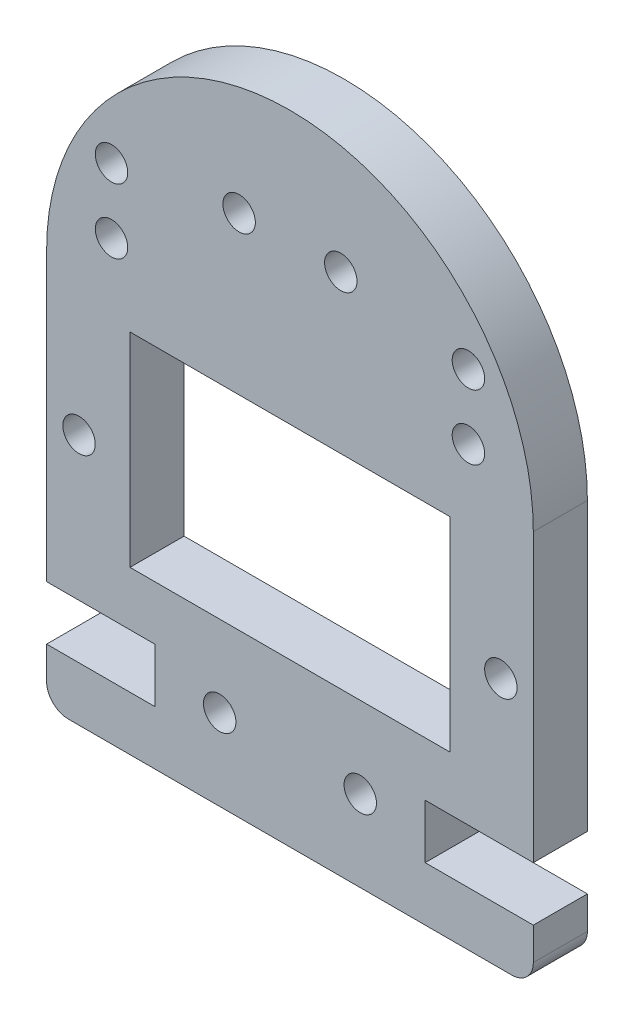
ISO-10303-21;
HEADER;
FILE_DESCRIPTION(('STEP AP214'),'2;1');
FILE_NAME('part.step','',(''),(''),'','','');
FILE_SCHEMA(('AUTOMOTIVE_DESIGN { 1 0 10303 214 1 1 1 1 }'));
ENDSEC;
DATA;
#1=APPLICATION_CONTEXT('core data for automotive mechanical design processes');
#2=APPLICATION_PROTOCOL_DEFINITION('international standard','automotive_design',2000,#1);
#3=PRODUCT_CONTEXT('',#1,'mechanical');
#4=PRODUCT('Part','Part','',(#3));
#5=PRODUCT_RELATED_PRODUCT_CATEGORY('part','',(#4));
#6=PRODUCT_DEFINITION_FORMATION('','',#4);
#7=PRODUCT_DEFINITION_CONTEXT('part definition',#1,'design');
#8=PRODUCT_DEFINITION('design','',#6,#7);
#9=PRODUCT_DEFINITION_SHAPE('','',#8);
#10=(LENGTH_UNIT() NAMED_UNIT(*) SI_UNIT(.MILLI.,.METRE.));
#11=(NAMED_UNIT(*) PLANE_ANGLE_UNIT() SI_UNIT($,.RADIAN.));
#12=(NAMED_UNIT(*) SI_UNIT($,.STERADIAN.) SOLID_ANGLE_UNIT());
#13=UNCERTAINTY_MEASURE_WITH_UNIT(LENGTH_MEASURE(1.E-05),#10,'distance_accuracy_value','');
#14=(GEOMETRIC_REPRESENTATION_CONTEXT(3) GLOBAL_UNCERTAINTY_ASSIGNED_CONTEXT((#13)) GLOBAL_UNIT_ASSIGNED_CONTEXT((#10,
#11,#12)) REPRESENTATION_CONTEXT('',''));
#15=CARTESIAN_POINT('',(0.,0.,0.));
#16=DIRECTION('',(0.,0.,1.));
#17=DIRECTION('',(1.,0.,0.));
#18=AXIS2_PLACEMENT_3D('',#15,#16,#17);
#19=CARTESIAN_POINT('',(-1.76634170575383,13.25,5.));
#20=DIRECTION('',(0.,0.,-1.));
#21=DIRECTION('',(-1.,0.,0.));
#22=AXIS2_PLACEMENT_3D('',#19,#20,#21);
#23=CYLINDRICAL_SURFACE('',#22,22.5);
#24=CARTESIAN_POINT('',(-1.76634170575383,13.25,0.));
#25=DIRECTION('',(0.,0.,1.));
#26=DIRECTION('',(1.,0.,0.));
#27=AXIS2_PLACEMENT_3D('',#24,#25,#26);
#28=CIRCLE('',#27,22.5);
#29=CARTESIAN_POINT('',(20.7336582942462,13.25,0.));
#30=VERTEX_POINT('',#29);
#31=CARTESIAN_POINT('',(-24.2663417057538,13.25,0.));
#32=VERTEX_POINT('',#31);
#33=EDGE_CURVE('E198',#30,#32,#28,.T.);
#34=ORIENTED_EDGE('',*,*,#33,.T.);
#35=DIRECTION('',(0.,0.,-1.));
#36=VECTOR('',#35,1.);
#37=CARTESIAN_POINT('',(-24.2663417057538,13.25,5.));
#38=LINE('',#37,#36);
#39=CARTESIAN_POINT('',(-24.2663417057538,13.25,5.));
#40=VERTEX_POINT('',#39);
#41=EDGE_CURVE('E11',#40,#32,#38,.T.);
#42=ORIENTED_EDGE('',*,*,#41,.F.);
#43=CARTESIAN_POINT('',(-1.76634170575383,13.25,5.));
#44=DIRECTION('',(0.,0.,1.));
#45=DIRECTION('',(1.,0.,0.));
#46=AXIS2_PLACEMENT_3D('',#43,#44,#45);
#47=CIRCLE('',#46,22.5);
#48=CARTESIAN_POINT('',(20.7336582942462,13.25,5.));
#49=VERTEX_POINT('',#48);
#50=EDGE_CURVE('E202',#49,#40,#47,.T.);
#51=ORIENTED_EDGE('',*,*,#50,.F.);
#52=DIRECTION('',(0.,0.,-1.));
#53=VECTOR('',#52,1.);
#54=CARTESIAN_POINT('',(20.7336582942462,13.25,5.));
#55=LINE('',#54,#53);
#56=EDGE_CURVE('E232',#49,#30,#55,.T.);
#57=ORIENTED_EDGE('',*,*,#56,.T.);
#58=EDGE_LOOP('',(#34,#42,#51,#57));
#59=FACE_BOUND('',#58,.T.);
#60=ADVANCED_FACE('F35',(#59),#23,.T.);
#61=CARTESIAN_POINT('',(-24.2663417057538,-13.25,5.));
#62=DIRECTION('',(1.,0.,0.));
#63=DIRECTION('',(0.,0.,-1.));
#64=AXIS2_PLACEMENT_3D('',#61,#62,#63);
#65=PLANE('',#64);
#66=DIRECTION('',(0.,-1.,0.));
#67=VECTOR('',#66,1.);
#68=CARTESIAN_POINT('',(-24.2663417057538,-13.25,0.));
#69=LINE('',#68,#67);
#70=CARTESIAN_POINT('',(-24.2663417057538,-13.25,0.));
#71=VERTEX_POINT('',#70);
#72=EDGE_CURVE('E235',#32,#71,#69,.T.);
#73=ORIENTED_EDGE('',*,*,#72,.T.);
#74=DIRECTION('',(0.,0.,-1.));
#75=VECTOR('',#74,1.);
#76=CARTESIAN_POINT('',(-24.2663417057538,-13.25,5.));
#77=LINE('',#76,#75);
#78=CARTESIAN_POINT('',(-24.2663417057538,-13.25,5.));
#79=VERTEX_POINT('',#78);
#80=EDGE_CURVE('E43',#79,#71,#77,.T.);
#81=ORIENTED_EDGE('',*,*,#80,.F.);
#82=DIRECTION('',(0.,-1.,0.));
#83=VECTOR('',#82,1.);
#84=CARTESIAN_POINT('',(-24.2663417057538,-3.25,5.));
#85=LINE('',#84,#83);
#86=EDGE_CURVE('E205',#40,#79,#85,.T.);
#87=ORIENTED_EDGE('',*,*,#86,.F.);
#88=ORIENTED_EDGE('',*,*,#41,.T.);
#89=EDGE_LOOP('',(#73,#81,#87,#88));
#90=FACE_BOUND('',#89,.T.);
#91=ADVANCED_FACE('F428',(#90),#65,.F.);
#92=CARTESIAN_POINT('',(-14.2663417057538,-13.25,5.));
#93=DIRECTION('',(0.,1.,0.));
#94=DIRECTION('',(0.,0.,1.));
#95=AXIS2_PLACEMENT_3D('',#92,#93,#94);
#96=PLANE('',#95);
#97=DIRECTION('',(1.,0.,0.));
#98=VECTOR('',#97,1.);
#99=CARTESIAN_POINT('',(-14.2663417057538,-13.25,0.));
#100=LINE('',#99,#98);
#101=CARTESIAN_POINT('',(-14.2663417057538,-13.25,0.));
#102=VERTEX_POINT('',#101);
#103=EDGE_CURVE('E237',#71,#102,#100,.T.);
#104=ORIENTED_EDGE('',*,*,#103,.T.);
#105=DIRECTION('',(0.,0.,-1.));
#106=VECTOR('',#105,1.);
#107=CARTESIAN_POINT('',(-14.2663417057538,-13.25,5.));
#108=LINE('',#107,#106);
#109=CARTESIAN_POINT('',(-14.2663417057538,-13.25,5.));
#110=VERTEX_POINT('',#109);
#111=EDGE_CURVE('E293',#110,#102,#108,.T.);
#112=ORIENTED_EDGE('',*,*,#111,.F.);
#113=DIRECTION('',(1.,0.,0.));
#114=VECTOR('',#113,1.);
#115=CARTESIAN_POINT('',(-14.2663417057538,-13.25,5.));
#116=LINE('',#115,#114);
#117=EDGE_CURVE('E208',#79,#110,#116,.T.);
#118=ORIENTED_EDGE('',*,*,#117,.F.);
#119=ORIENTED_EDGE('',*,*,#80,.T.);
#120=EDGE_LOOP('',(#104,#112,#118,#119));
#121=FACE_BOUND('',#120,.T.);
#122=ADVANCED_FACE('F424',(#121),#96,.F.);
#123=CARTESIAN_POINT('',(-14.2663417057538,-13.25,5.));
#124=DIRECTION('',(1.,0.,0.));
#125=DIRECTION('',(0.,0.,-1.));
#126=AXIS2_PLACEMENT_3D('',#123,#124,#125);
#127=PLANE('',#126);
#128=DIRECTION('',(0.,-1.,0.));
#129=VECTOR('',#128,1.);
#130=CARTESIAN_POINT('',(-14.2663417057538,-13.25,0.));
#131=LINE('',#130,#129);
#132=CARTESIAN_POINT('',(-14.2663417057538,-18.25,0.));
#133=VERTEX_POINT('',#132);
#134=EDGE_CURVE('E239',#102,#133,#131,.T.);
#135=ORIENTED_EDGE('',*,*,#134,.T.);
#136=DIRECTION('',(0.,0.,-1.));
#137=VECTOR('',#136,1.);
#138=CARTESIAN_POINT('',(-14.2663417057538,-18.25,5.));
#139=LINE('',#138,#137);
#140=CARTESIAN_POINT('',(-14.2663417057538,-18.25,5.));
#141=VERTEX_POINT('',#140);
#142=EDGE_CURVE('E290',#141,#133,#139,.T.);
#143=ORIENTED_EDGE('',*,*,#142,.F.);
#144=DIRECTION('',(0.,-1.,0.));
#145=VECTOR('',#144,1.);
#146=CARTESIAN_POINT('',(-14.2663417057538,-13.25,5.));
#147=LINE('',#146,#145);
#148=EDGE_CURVE('E210',#110,#141,#147,.T.);
#149=ORIENTED_EDGE('',*,*,#148,.F.);
#150=ORIENTED_EDGE('',*,*,#111,.T.);
#151=EDGE_LOOP('',(#135,#143,#149,#150));
#152=FACE_BOUND('',#151,.T.);
#153=ADVANCED_FACE('F421',(#152),#127,.F.);
#154=CARTESIAN_POINT('',(-14.2663417057538,-18.25,5.));
#155=DIRECTION('',(0.,-1.,0.));
#156=DIRECTION('',(0.,0.,-1.));
#157=AXIS2_PLACEMENT_3D('',#154,#155,#156);
#158=PLANE('',#157);
#159=DIRECTION('',(-1.,0.,0.));
#160=VECTOR('',#159,1.);
#161=CARTESIAN_POINT('',(-14.2663417057538,-18.25,0.));
#162=LINE('',#161,#160);
#163=CARTESIAN_POINT('',(-24.2663417057538,-18.25,0.));
#164=VERTEX_POINT('',#163);
#165=EDGE_CURVE('E241',#133,#164,#162,.T.);
#166=ORIENTED_EDGE('',*,*,#165,.T.);
#167=DIRECTION('',(0.,0.,-1.));
#168=VECTOR('',#167,1.);
#169=CARTESIAN_POINT('',(-24.2663417057538,-18.25,5.));
#170=LINE('',#169,#168);
#171=CARTESIAN_POINT('',(-24.2663417057538,-18.25,5.));
#172=VERTEX_POINT('',#171);
#173=EDGE_CURVE('E287',#172,#164,#170,.T.);
#174=ORIENTED_EDGE('',*,*,#173,.F.);
#175=DIRECTION('',(-1.,0.,0.));
#176=VECTOR('',#175,1.);
#177=CARTESIAN_POINT('',(-14.2663417057538,-18.25,5.));
#178=LINE('',#177,#176);
#179=EDGE_CURVE('E212',#141,#172,#178,.T.);
#180=ORIENTED_EDGE('',*,*,#179,.F.);
#181=ORIENTED_EDGE('',*,*,#142,.T.);
#182=EDGE_LOOP('',(#166,#174,#180,#181));
#183=FACE_BOUND('',#182,.T.);
#184=ADVANCED_FACE('F417',(#183),#158,.F.);
#185=CARTESIAN_POINT('',(-24.2663417057538,-18.25,5.));
#186=DIRECTION('',(1.,0.,0.));
#187=DIRECTION('',(0.,0.,-1.));
#188=AXIS2_PLACEMENT_3D('',#185,#186,#187);
#189=PLANE('',#188);
#190=DIRECTION('',(0.,-1.,0.));
#191=VECTOR('',#190,1.);
#192=CARTESIAN_POINT('',(-24.2663417057538,-18.25,0.));
#193=LINE('',#192,#191);
#194=CARTESIAN_POINT('',(-24.2663417057538,-21.25,0.));
#195=VERTEX_POINT('',#194);
#196=EDGE_CURVE('E243',#164,#195,#193,.T.);
#197=ORIENTED_EDGE('',*,*,#196,.T.);
#198=DIRECTION('',(0.,0.,-1.));
#199=VECTOR('',#198,1.);
#200=CARTESIAN_POINT('',(-24.2663417057538,-21.25,5.));
#201=LINE('',#200,#199);
#202=CARTESIAN_POINT('',(-24.2663417057538,-21.25,5.));
#203=VERTEX_POINT('',#202);
#204=EDGE_CURVE('E284',#203,#195,#201,.T.);
#205=ORIENTED_EDGE('',*,*,#204,.F.);
#206=DIRECTION('',(0.,-1.,0.));
#207=VECTOR('',#206,1.);
#208=CARTESIAN_POINT('',(-24.2663417057538,-18.25,5.));
#209=LINE('',#208,#207);
#210=EDGE_CURVE('E214',#172,#203,#209,.T.);
#211=ORIENTED_EDGE('',*,*,#210,.F.);
#212=ORIENTED_EDGE('',*,*,#173,.T.);
#213=EDGE_LOOP('',(#197,#205,#211,#212));
#214=FACE_BOUND('',#213,.T.);
#215=ADVANCED_FACE('F412',(#214),#189,.F.);
#216=CARTESIAN_POINT('',(-22.2663417057538,-21.25,5.));
#217=DIRECTION('',(0.,0.,-1.));
#218=DIRECTION('',(-1.,0.,0.));
#219=AXIS2_PLACEMENT_3D('',#216,#217,#218);
#220=CYLINDRICAL_SURFACE('',#219,2.);
#221=CARTESIAN_POINT('',(-22.2663417057538,-21.25,0.));
#222=DIRECTION('',(0.,0.,1.));
#223=DIRECTION('',(1.,0.,0.));
#224=AXIS2_PLACEMENT_3D('',#221,#222,#223);
#225=CIRCLE('',#224,2.);
#226=CARTESIAN_POINT('',(-22.2663417057538,-23.25,0.));
#227=VERTEX_POINT('',#226);
#228=EDGE_CURVE('E245',#195,#227,#225,.T.);
#229=ORIENTED_EDGE('',*,*,#228,.T.);
#230=DIRECTION('',(0.,0.,-1.));
#231=VECTOR('',#230,1.);
#232=CARTESIAN_POINT('',(-22.2663417057538,-23.25,5.));
#233=LINE('',#232,#231);
#234=CARTESIAN_POINT('',(-22.2663417057538,-23.25,5.));
#235=VERTEX_POINT('',#234);
#236=EDGE_CURVE('E281',#235,#227,#233,.T.);
#237=ORIENTED_EDGE('',*,*,#236,.F.);
#238=CARTESIAN_POINT('',(-22.2663417057538,-21.25,5.));
#239=DIRECTION('',(0.,0.,1.));
#240=DIRECTION('',(1.,0.,0.));
#241=AXIS2_PLACEMENT_3D('',#238,#239,#240);
#242=CIRCLE('',#241,2.);
#243=EDGE_CURVE('E216',#203,#235,#242,.T.);
#244=ORIENTED_EDGE('',*,*,#243,.F.);
#245=ORIENTED_EDGE('',*,*,#204,.T.);
#246=EDGE_LOOP('',(#229,#237,#244,#245));
#247=FACE_BOUND('',#246,.T.);
#248=ADVANCED_FACE('F406',(#247),#220,.T.);
#249=CARTESIAN_POINT('',(18.7336582942462,-23.25,5.));
#250=DIRECTION('',(0.,1.,0.));
#251=DIRECTION('',(0.,0.,1.));
#252=AXIS2_PLACEMENT_3D('',#249,#250,#251);
#253=PLANE('',#252);
#254=DIRECTION('',(1.,0.,0.));
#255=VECTOR('',#254,1.);
#256=CARTESIAN_POINT('',(18.7336582942462,-23.25,0.));
#257=LINE('',#256,#255);
#258=CARTESIAN_POINT('',(18.7336582942462,-23.25,0.));
#259=VERTEX_POINT('',#258);
#260=EDGE_CURVE('E247',#227,#259,#257,.T.);
#261=ORIENTED_EDGE('',*,*,#260,.T.);
#262=DIRECTION('',(0.,0.,-1.));
#263=VECTOR('',#262,1.);
#264=CARTESIAN_POINT('',(18.7336582942462,-23.25,5.));
#265=LINE('',#264,#263);
#266=CARTESIAN_POINT('',(18.7336582942462,-23.25,5.));
#267=VERTEX_POINT('',#266);
#268=EDGE_CURVE('E278',#267,#259,#265,.T.);
#269=ORIENTED_EDGE('',*,*,#268,.F.);
#270=DIRECTION('',(1.,0.,0.));
#271=VECTOR('',#270,1.);
#272=CARTESIAN_POINT('',(18.7336582942462,-23.25,5.));
#273=LINE('',#272,#271);
#274=EDGE_CURVE('E218',#235,#267,#273,.T.);
#275=ORIENTED_EDGE('',*,*,#274,.F.);
#276=ORIENTED_EDGE('',*,*,#236,.T.);
#277=EDGE_LOOP('',(#261,#269,#275,#276));
#278=FACE_BOUND('',#277,.T.);
#279=ADVANCED_FACE('F402',(#278),#253,.F.);
#280=CARTESIAN_POINT('',(18.7336582942462,-21.25,5.));
#281=DIRECTION('',(0.,0.,-1.));
#282=DIRECTION('',(-1.,0.,0.));
#283=AXIS2_PLACEMENT_3D('',#280,#281,#282);
#284=CYLINDRICAL_SURFACE('',#283,2.);
#285=CARTESIAN_POINT('',(18.7336582942462,-21.25,0.));
#286=DIRECTION('',(0.,0.,1.));
#287=DIRECTION('',(1.,0.,0.));
#288=AXIS2_PLACEMENT_3D('',#285,#286,#287);
#289=CIRCLE('',#288,2.);
#290=CARTESIAN_POINT('',(20.7336582942462,-21.25,0.));
#291=VERTEX_POINT('',#290);
#292=EDGE_CURVE('E249',#259,#291,#289,.T.);
#293=ORIENTED_EDGE('',*,*,#292,.T.);
#294=DIRECTION('',(0.,0.,-1.));
#295=VECTOR('',#294,1.);
#296=CARTESIAN_POINT('',(20.7336582942462,-21.25,5.));
#297=LINE('',#296,#295);
#298=CARTESIAN_POINT('',(20.7336582942462,-21.25,5.));
#299=VERTEX_POINT('',#298);
#300=EDGE_CURVE('E275',#299,#291,#297,.T.);
#301=ORIENTED_EDGE('',*,*,#300,.F.);
#302=CARTESIAN_POINT('',(18.7336582942462,-21.25,5.));
#303=DIRECTION('',(0.,0.,1.));
#304=DIRECTION('',(1.,0.,0.));
#305=AXIS2_PLACEMENT_3D('',#302,#303,#304);
#306=CIRCLE('',#305,2.);
#307=EDGE_CURVE('E220',#267,#299,#306,.T.);
#308=ORIENTED_EDGE('',*,*,#307,.F.);
#309=ORIENTED_EDGE('',*,*,#268,.T.);
#310=EDGE_LOOP('',(#293,#301,#308,#309));
#311=FACE_BOUND('',#310,.T.);
#312=ADVANCED_FACE('F397',(#311),#284,.T.);
#313=CARTESIAN_POINT('',(20.7336582942462,-18.25,5.));
#314=DIRECTION('',(-1.,0.,0.));
#315=DIRECTION('',(0.,0.,1.));
#316=AXIS2_PLACEMENT_3D('',#313,#314,#315);
#317=PLANE('',#316);
#318=DIRECTION('',(0.,1.,0.));
#319=VECTOR('',#318,1.);
#320=CARTESIAN_POINT('',(20.7336582942462,-18.25,0.));
#321=LINE('',#320,#319);
#322=CARTESIAN_POINT('',(20.7336582942462,-18.25,0.));
#323=VERTEX_POINT('',#322);
#324=EDGE_CURVE('E251',#291,#323,#321,.T.);
#325=ORIENTED_EDGE('',*,*,#324,.T.);
#326=DIRECTION('',(0.,0.,-1.));
#327=VECTOR('',#326,1.);
#328=CARTESIAN_POINT('',(20.7336582942462,-18.25,5.));
#329=LINE('',#328,#327);
#330=CARTESIAN_POINT('',(20.7336582942462,-18.25,5.));
#331=VERTEX_POINT('',#330);
#332=EDGE_CURVE('E272',#331,#323,#329,.T.);
#333=ORIENTED_EDGE('',*,*,#332,.F.);
#334=DIRECTION('',(0.,1.,0.));
#335=VECTOR('',#334,1.);
#336=CARTESIAN_POINT('',(20.7336582942462,-18.25,5.));
#337=LINE('',#336,#335);
#338=EDGE_CURVE('E222',#299,#331,#337,.T.);
#339=ORIENTED_EDGE('',*,*,#338,.F.);
#340=ORIENTED_EDGE('',*,*,#300,.T.);
#341=EDGE_LOOP('',(#325,#333,#339,#340));
#342=FACE_BOUND('',#341,.T.);
#343=ADVANCED_FACE('F391',(#342),#317,.F.);
#344=CARTESIAN_POINT('',(10.7336582942462,-18.25,5.));
#345=DIRECTION('',(0.,-1.,0.));
#346=DIRECTION('',(0.,0.,-1.));
#347=AXIS2_PLACEMENT_3D('',#344,#345,#346);
#348=PLANE('',#347);
#349=DIRECTION('',(-1.,0.,0.));
#350=VECTOR('',#349,1.);
#351=CARTESIAN_POINT('',(10.7336582942462,-18.25,0.));
#352=LINE('',#351,#350);
#353=CARTESIAN_POINT('',(10.7336582942462,-18.25,0.));
#354=VERTEX_POINT('',#353);
#355=EDGE_CURVE('E253',#323,#354,#352,.T.);
#356=ORIENTED_EDGE('',*,*,#355,.T.);
#357=DIRECTION('',(0.,0.,-1.));
#358=VECTOR('',#357,1.);
#359=CARTESIAN_POINT('',(10.7336582942462,-18.25,5.));
#360=LINE('',#359,#358);
#361=CARTESIAN_POINT('',(10.7336582942462,-18.25,5.));
#362=VERTEX_POINT('',#361);
#363=EDGE_CURVE('E269',#362,#354,#360,.T.);
#364=ORIENTED_EDGE('',*,*,#363,.F.);
#365=DIRECTION('',(-1.,0.,0.));
#366=VECTOR('',#365,1.);
#367=CARTESIAN_POINT('',(10.7336582942462,-18.25,5.));
#368=LINE('',#367,#366);
#369=EDGE_CURVE('E224',#331,#362,#368,.T.);
#370=ORIENTED_EDGE('',*,*,#369,.F.);
#371=ORIENTED_EDGE('',*,*,#332,.T.);
#372=EDGE_LOOP('',(#356,#364,#370,#371));
#373=FACE_BOUND('',#372,.T.);
#374=ADVANCED_FACE('F387',(#373),#348,.F.);
#375=CARTESIAN_POINT('',(10.7336582942462,-13.25,5.));
#376=DIRECTION('',(-1.,0.,0.));
#377=DIRECTION('',(0.,-1.,0.));
#378=AXIS2_PLACEMENT_3D('',#375,#376,#377);
#379=PLANE('',#378);
#380=DIRECTION('',(0.,1.,0.));
#381=VECTOR('',#380,1.);
#382=CARTESIAN_POINT('',(10.7336582942462,-13.25,0.));
#383=LINE('',#382,#381);
#384=CARTESIAN_POINT('',(10.7336582942462,-13.25,0.));
#385=VERTEX_POINT('',#384);
#386=EDGE_CURVE('E255',#354,#385,#383,.T.);
#387=ORIENTED_EDGE('',*,*,#386,.T.);
#388=DIRECTION('',(0.,0.,-1.));
#389=VECTOR('',#388,1.);
#390=CARTESIAN_POINT('',(10.7336582942462,-13.25,5.));
#391=LINE('',#390,#389);
#392=CARTESIAN_POINT('',(10.7336582942462,-13.25,5.));
#393=VERTEX_POINT('',#392);
#394=EDGE_CURVE('E266',#393,#385,#391,.T.);
#395=ORIENTED_EDGE('',*,*,#394,.F.);
#396=DIRECTION('',(0.,1.,0.));
#397=VECTOR('',#396,1.);
#398=CARTESIAN_POINT('',(10.7336582942462,-13.25,5.));
#399=LINE('',#398,#397);
#400=EDGE_CURVE('E226',#362,#393,#399,.T.);
#401=ORIENTED_EDGE('',*,*,#400,.F.);
#402=ORIENTED_EDGE('',*,*,#363,.T.);
#403=EDGE_LOOP('',(#387,#395,#401,#402));
#404=FACE_BOUND('',#403,.T.);
#405=ADVANCED_FACE('F382',(#404),#379,.F.);
#406=CARTESIAN_POINT('',(10.7336582942462,-13.25,5.));
#407=DIRECTION('',(0.,1.,0.));
#408=DIRECTION('',(0.,0.,1.));
#409=AXIS2_PLACEMENT_3D('',#406,#407,#408);
#410=PLANE('',#409);
#411=DIRECTION('',(1.,0.,0.));
#412=VECTOR('',#411,1.);
#413=CARTESIAN_POINT('',(10.7336582942462,-13.25,0.));
#414=LINE('',#413,#412);
#415=CARTESIAN_POINT('',(20.7336582942462,-13.25,0.));
#416=VERTEX_POINT('',#415);
#417=EDGE_CURVE('E257',#385,#416,#414,.T.);
#418=ORIENTED_EDGE('',*,*,#417,.T.);
#419=DIRECTION('',(0.,0.,-1.));
#420=VECTOR('',#419,1.);
#421=CARTESIAN_POINT('',(20.7336582942462,-13.25,5.));
#422=LINE('',#421,#420);
#423=CARTESIAN_POINT('',(20.7336582942462,-13.25,5.));
#424=VERTEX_POINT('',#423);
#425=EDGE_CURVE('E263',#424,#416,#422,.T.);
#426=ORIENTED_EDGE('',*,*,#425,.F.);
#427=DIRECTION('',(1.,0.,0.));
#428=VECTOR('',#427,1.);
#429=CARTESIAN_POINT('',(10.7336582942462,-13.25,5.));
#430=LINE('',#429,#428);
#431=EDGE_CURVE('E228',#393,#424,#430,.T.);
#432=ORIENTED_EDGE('',*,*,#431,.F.);
#433=ORIENTED_EDGE('',*,*,#394,.T.);
#434=EDGE_LOOP('',(#418,#426,#432,#433));
#435=FACE_BOUND('',#434,.T.);
#436=ADVANCED_FACE('F376',(#435),#410,.F.);
#437=CARTESIAN_POINT('',(20.7336582942462,-3.22226862184038,5.));
#438=DIRECTION('',(-1.,0.,0.));
#439=DIRECTION('',(0.,0.,1.));
#440=AXIS2_PLACEMENT_3D('',#437,#438,#439);
#441=PLANE('',#440);
#442=DIRECTION('',(0.,1.,0.));
#443=VECTOR('',#442,1.);
#444=CARTESIAN_POINT('',(20.7336582942462,-3.22226862184038,0.));
#445=LINE('',#444,#443);
#446=EDGE_CURVE('E206',#416,#30,#445,.T.);
#447=ORIENTED_EDGE('',*,*,#446,.T.);
#448=ORIENTED_EDGE('',*,*,#56,.F.);
#449=DIRECTION('',(0.,1.,0.));
#450=VECTOR('',#449,1.);
#451=CARTESIAN_POINT('',(20.7336582942462,-13.25,5.));
#452=LINE('',#451,#450);
#453=EDGE_CURVE('E230',#424,#49,#452,.T.);
#454=ORIENTED_EDGE('',*,*,#453,.F.);
#455=ORIENTED_EDGE('',*,*,#425,.T.);
#456=EDGE_LOOP('',(#447,#448,#454,#455));
#457=FACE_BOUND('',#456,.T.);
#458=ADVANCED_FACE('F372',(#457),#441,.F.);
#459=CARTESIAN_POINT('',(-1.76634170575383,13.25,5.));
#460=DIRECTION('',(0.,0.,1.));
#461=DIRECTION('',(1.,0.,0.));
#462=AXIS2_PLACEMENT_3D('',#459,#460,#461);
#463=PLANE('',#462);
#464=CARTESIAN_POINT('',(14.7336582942462,23.25,5.));
#465=DIRECTION('',(0.,0.,1.));
#466=DIRECTION('',(1.,0.,0.));
#467=AXIS2_PLACEMENT_3D('',#464,#465,#466);
#468=CIRCLE('',#467,1.5);
#469=CARTESIAN_POINT('',(16.2336582942462,23.25,5.));
#470=VERTEX_POINT('',#469);
#471=EDGE_CURVE('E322',#470,#470,#468,.T.);
#472=ORIENTED_EDGE('',*,*,#471,.F.);
#473=EDGE_LOOP('',(#472));
#474=FACE_BOUND('',#473,.T.);
#475=CARTESIAN_POINT('',(-18.2663417057538,23.25,5.));
#476=DIRECTION('',(0.,0.,1.));
#477=DIRECTION('',(1.,0.,0.));
#478=AXIS2_PLACEMENT_3D('',#475,#476,#477);
#479=CIRCLE('',#478,1.5);
#480=CARTESIAN_POINT('',(-16.7663417057538,23.25,5.));
#481=VERTEX_POINT('',#480);
#482=EDGE_CURVE('E624',#481,#481,#479,.T.);
#483=ORIENTED_EDGE('',*,*,#482,.F.);
#484=EDGE_LOOP('',(#483));
#485=FACE_BOUND('',#484,.T.);
#486=CARTESIAN_POINT('',(-18.2663417057538,17.25,5.));
#487=DIRECTION('',(0.,0.,1.));
#488=DIRECTION('',(1.,0.,0.));
#489=AXIS2_PLACEMENT_3D('',#486,#487,#488);
#490=CIRCLE('',#489,1.5);
#491=CARTESIAN_POINT('',(-16.7663417057538,17.25,5.));
#492=VERTEX_POINT('',#491);
#493=EDGE_CURVE('E335',#492,#492,#490,.T.);
#494=ORIENTED_EDGE('',*,*,#493,.F.);
#495=EDGE_LOOP('',(#494));
#496=FACE_BOUND('',#495,.T.);
#497=CARTESIAN_POINT('',(14.7336582942462,17.25,5.));
#498=DIRECTION('',(0.,0.,1.));
#499=DIRECTION('',(1.,0.,0.));
#500=AXIS2_PLACEMENT_3D('',#497,#498,#499);
#501=CIRCLE('',#500,1.5);
#502=CARTESIAN_POINT('',(16.2336582942462,17.25,5.));
#503=VERTEX_POINT('',#502);
#504=EDGE_CURVE('E318',#503,#503,#501,.T.);
#505=ORIENTED_EDGE('',*,*,#504,.F.);
#506=EDGE_LOOP('',(#505));
#507=FACE_BOUND('',#506,.T.);
#508=CARTESIAN_POINT('',(-6.46634170575383,25.15,5.));
#509=DIRECTION('',(0.,0.,1.));
#510=DIRECTION('',(1.,0.,0.));
#511=AXIS2_PLACEMENT_3D('',#508,#509,#510);
#512=CIRCLE('',#511,1.5);
#513=CARTESIAN_POINT('',(-4.96634170575383,25.15,5.));
#514=VERTEX_POINT('',#513);
#515=EDGE_CURVE('E314',#514,#514,#512,.T.);
#516=ORIENTED_EDGE('',*,*,#515,.F.);
#517=EDGE_LOOP('',(#516));
#518=FACE_BOUND('',#517,.T.);
#519=CARTESIAN_POINT('',(2.93365829424617,25.15,5.));
#520=DIRECTION('',(0.,0.,1.));
#521=DIRECTION('',(1.,0.,0.));
#522=AXIS2_PLACEMENT_3D('',#519,#520,#521);
#523=CIRCLE('',#522,1.5);
#524=CARTESIAN_POINT('',(4.43365829424617,25.15,5.));
#525=VERTEX_POINT('',#524);
#526=EDGE_CURVE('E310',#525,#525,#523,.T.);
#527=ORIENTED_EDGE('',*,*,#526,.F.);
#528=EDGE_LOOP('',(#527));
#529=FACE_BOUND('',#528,.T.);
#530=CARTESIAN_POINT('',(-8.26634170575383,-15.75,5.));
#531=DIRECTION('',(0.,0.,1.));
#532=DIRECTION('',(1.,0.,0.));
#533=AXIS2_PLACEMENT_3D('',#530,#531,#532);
#534=CIRCLE('',#533,1.5);
#535=CARTESIAN_POINT('',(-6.76634170575383,-15.75,5.));
#536=VERTEX_POINT('',#535);
#537=EDGE_CURVE('E306',#536,#536,#534,.T.);
#538=ORIENTED_EDGE('',*,*,#537,.F.);
#539=EDGE_LOOP('',(#538));
#540=FACE_BOUND('',#539,.T.);
#541=CARTESIAN_POINT('',(4.73365829424617,-15.75,5.));
#542=DIRECTION('',(0.,0.,1.));
#543=DIRECTION('',(1.,0.,0.));
#544=AXIS2_PLACEMENT_3D('',#541,#542,#543);
#545=CIRCLE('',#544,1.5);
#546=CARTESIAN_POINT('',(6.23365829424617,-15.75,5.));
#547=VERTEX_POINT('',#546);
#548=EDGE_CURVE('E302',#547,#547,#545,.T.);
#549=ORIENTED_EDGE('',*,*,#548,.F.);
#550=EDGE_LOOP('',(#549));
#551=FACE_BOUND('',#550,.T.);
#552=CARTESIAN_POINT('',(-21.2663417057538,0.,5.));
#553=DIRECTION('',(0.,0.,-1.));
#554=DIRECTION('',(-1.,0.,0.));
#555=AXIS2_PLACEMENT_3D('',#552,#553,#554);
#556=CIRCLE('',#555,1.5);
#557=CARTESIAN_POINT('',(-22.7663417057538,0.,5.));
#558=VERTEX_POINT('',#557);
#559=EDGE_CURVE('E345',#558,#558,#556,.T.);
#560=ORIENTED_EDGE('',*,*,#559,.T.);
#561=EDGE_LOOP('',(#560));
#562=FACE_BOUND('',#561,.T.);
#563=CARTESIAN_POINT('',(17.7336582942462,0.,5.));
#564=DIRECTION('',(0.,0.,-1.));
#565=DIRECTION('',(-1.,0.,0.));
#566=AXIS2_PLACEMENT_3D('',#563,#564,#565);
#567=CIRCLE('',#566,1.5);
#568=CARTESIAN_POINT('',(16.2336582942462,0.,5.));
#569=VERTEX_POINT('',#568);
#570=EDGE_CURVE('E192',#569,#569,#567,.T.);
#571=ORIENTED_EDGE('',*,*,#570,.T.);
#572=EDGE_LOOP('',(#571));
#573=FACE_BOUND('',#572,.T.);
#574=DIRECTION('',(0.,1.,0.));
#575=VECTOR('',#574,1.);
#576=CARTESIAN_POINT('',(-16.5563417057538,-8.25,5.));
#577=LINE('',#576,#575);
#578=CARTESIAN_POINT('',(-16.5563417057538,-8.25,5.));
#579=VERTEX_POINT('',#578);
#580=CARTESIAN_POINT('',(-16.5563417057538,10.6,5.));
#581=VERTEX_POINT('',#580);
#582=EDGE_CURVE('E163',#579,#581,#577,.T.);
#583=ORIENTED_EDGE('',*,*,#582,.T.);
#584=DIRECTION('',(1.,0.,0.));
#585=VECTOR('',#584,1.);
#586=CARTESIAN_POINT('',(-16.5563417057538,10.6,5.));
#587=LINE('',#586,#585);
#588=CARTESIAN_POINT('',(13.0236582942462,10.6,5.));
#589=VERTEX_POINT('',#588);
#590=EDGE_CURVE('E172',#581,#589,#587,.T.);
#591=ORIENTED_EDGE('',*,*,#590,.T.);
#592=DIRECTION('',(0.,-1.,0.));
#593=VECTOR('',#592,1.);
#594=CARTESIAN_POINT('',(13.0236582942462,-8.25,5.));
#595=LINE('',#594,#593);
#596=CARTESIAN_POINT('',(13.0236582942462,-8.25,5.));
#597=VERTEX_POINT('',#596);
#598=EDGE_CURVE('E51',#589,#597,#595,.T.);
#599=ORIENTED_EDGE('',*,*,#598,.T.);
#600=DIRECTION('',(-1.,0.,0.));
#601=VECTOR('',#600,1.);
#602=CARTESIAN_POINT('',(-16.5563417057538,-8.25,5.));
#603=LINE('',#602,#601);
#604=EDGE_CURVE('E169',#597,#579,#603,.T.);
#605=ORIENTED_EDGE('',*,*,#604,.T.);
#606=EDGE_LOOP('',(#583,#591,#599,#605));
#607=FACE_BOUND('',#606,.T.);
#608=ORIENTED_EDGE('',*,*,#50,.T.);
#609=ORIENTED_EDGE('',*,*,#86,.T.);
#610=ORIENTED_EDGE('',*,*,#117,.T.);
#611=ORIENTED_EDGE('',*,*,#148,.T.);
#612=ORIENTED_EDGE('',*,*,#179,.T.);
#613=ORIENTED_EDGE('',*,*,#210,.T.);
#614=ORIENTED_EDGE('',*,*,#243,.T.);
#615=ORIENTED_EDGE('',*,*,#274,.T.);
#616=ORIENTED_EDGE('',*,*,#307,.T.);
#617=ORIENTED_EDGE('',*,*,#338,.T.);
#618=ORIENTED_EDGE('',*,*,#369,.T.);
#619=ORIENTED_EDGE('',*,*,#400,.T.);
#620=ORIENTED_EDGE('',*,*,#431,.T.);
#621=ORIENTED_EDGE('',*,*,#453,.T.);
#622=EDGE_LOOP('',(#608,#609,#610,#611,#612,#613,#614,#615,#616,#617,#618,#619,#620,#621));
#623=FACE_BOUND('',#622,.T.);
#624=ADVANCED_FACE('F176',(#474,#485,#496,#507,#518,#529,#540,#551,#562,#573,#607,#623),#463,.T.);
#625=CARTESIAN_POINT('',(-1.76634170575383,13.25,0.));
#626=DIRECTION('',(0.,0.,1.));
#627=DIRECTION('',(1.,0.,0.));
#628=AXIS2_PLACEMENT_3D('',#625,#626,#627);
#629=PLANE('',#628);
#630=CARTESIAN_POINT('',(14.7336582942462,23.25,0.));
#631=DIRECTION('',(0.,0.,1.));
#632=DIRECTION('',(1.,0.,0.));
#633=AXIS2_PLACEMENT_3D('',#630,#631,#632);
#634=CIRCLE('',#633,1.5);
#635=CARTESIAN_POINT('',(16.2336582942462,23.25,0.));
#636=VERTEX_POINT('',#635);
#637=EDGE_CURVE('E38',#636,#636,#634,.T.);
#638=ORIENTED_EDGE('',*,*,#637,.T.);
#639=EDGE_LOOP('',(#638));
#640=FACE_BOUND('',#639,.T.);
#641=CARTESIAN_POINT('',(-18.2663417057538,23.25,0.));
#642=DIRECTION('',(0.,0.,1.));
#643=DIRECTION('',(1.,0.,0.));
#644=AXIS2_PLACEMENT_3D('',#641,#642,#643);
#645=CIRCLE('',#644,1.5);
#646=CARTESIAN_POINT('',(-16.7663417057538,23.25,0.));
#647=VERTEX_POINT('',#646);
#648=EDGE_CURVE('E321',#647,#647,#645,.T.);
#649=ORIENTED_EDGE('',*,*,#648,.T.);
#650=EDGE_LOOP('',(#649));
#651=FACE_BOUND('',#650,.T.);
#652=CARTESIAN_POINT('',(-18.2663417057538,17.25,0.));
#653=DIRECTION('',(0.,0.,1.));
#654=DIRECTION('',(1.,0.,0.));
#655=AXIS2_PLACEMENT_3D('',#652,#653,#654);
#656=CIRCLE('',#655,1.5);
#657=CARTESIAN_POINT('',(-16.7663417057538,17.25,0.));
#658=VERTEX_POINT('',#657);
#659=EDGE_CURVE('E319',#658,#658,#656,.T.);
#660=ORIENTED_EDGE('',*,*,#659,.T.);
#661=EDGE_LOOP('',(#660));
#662=FACE_BOUND('',#661,.T.);
#663=CARTESIAN_POINT('',(14.7336582942462,17.25,0.));
#664=DIRECTION('',(0.,0.,1.));
#665=DIRECTION('',(1.,0.,0.));
#666=AXIS2_PLACEMENT_3D('',#663,#664,#665);
#667=CIRCLE('',#666,1.5);
#668=CARTESIAN_POINT('',(16.2336582942462,17.25,0.));
#669=VERTEX_POINT('',#668);
#670=EDGE_CURVE('E315',#669,#669,#667,.T.);
#671=ORIENTED_EDGE('',*,*,#670,.T.);
#672=EDGE_LOOP('',(#671));
#673=FACE_BOUND('',#672,.T.);
#674=CARTESIAN_POINT('',(-6.46634170575383,25.15,0.));
#675=DIRECTION('',(0.,0.,1.));
#676=DIRECTION('',(1.,0.,0.));
#677=AXIS2_PLACEMENT_3D('',#674,#675,#676);
#678=CIRCLE('',#677,1.5);
#679=CARTESIAN_POINT('',(-4.96634170575383,25.15,0.));
#680=VERTEX_POINT('',#679);
#681=EDGE_CURVE('E311',#680,#680,#678,.T.);
#682=ORIENTED_EDGE('',*,*,#681,.T.);
#683=EDGE_LOOP('',(#682));
#684=FACE_BOUND('',#683,.T.);
#685=CARTESIAN_POINT('',(2.93365829424617,25.15,0.));
#686=DIRECTION('',(0.,0.,1.));
#687=DIRECTION('',(1.,0.,0.));
#688=AXIS2_PLACEMENT_3D('',#685,#686,#687);
#689=CIRCLE('',#688,1.5);
#690=CARTESIAN_POINT('',(4.43365829424617,25.15,0.));
#691=VERTEX_POINT('',#690);
#692=EDGE_CURVE('E307',#691,#691,#689,.T.);
#693=ORIENTED_EDGE('',*,*,#692,.T.);
#694=EDGE_LOOP('',(#693));
#695=FACE_BOUND('',#694,.T.);
#696=CARTESIAN_POINT('',(-8.26634170575383,-15.75,0.));
#697=DIRECTION('',(0.,0.,1.));
#698=DIRECTION('',(1.,0.,0.));
#699=AXIS2_PLACEMENT_3D('',#696,#697,#698);
#700=CIRCLE('',#699,1.5);
#701=CARTESIAN_POINT('',(-6.76634170575383,-15.75,0.));
#702=VERTEX_POINT('',#701);
#703=EDGE_CURVE('E303',#702,#702,#700,.T.);
#704=ORIENTED_EDGE('',*,*,#703,.T.);
#705=EDGE_LOOP('',(#704));
#706=FACE_BOUND('',#705,.T.);
#707=CARTESIAN_POINT('',(4.73365829424617,-15.75,0.));
#708=DIRECTION('',(0.,0.,1.));
#709=DIRECTION('',(1.,0.,0.));
#710=AXIS2_PLACEMENT_3D('',#707,#708,#709);
#711=CIRCLE('',#710,1.5);
#712=CARTESIAN_POINT('',(6.23365829424617,-15.75,0.));
#713=VERTEX_POINT('',#712);
#714=EDGE_CURVE('E298',#713,#713,#711,.T.);
#715=ORIENTED_EDGE('',*,*,#714,.T.);
#716=EDGE_LOOP('',(#715));
#717=FACE_BOUND('',#716,.T.);
#718=CARTESIAN_POINT('',(-21.2663417057538,0.,0.));
#719=DIRECTION('',(0.,0.,-1.));
#720=DIRECTION('',(-1.,0.,0.));
#721=AXIS2_PLACEMENT_3D('',#718,#719,#720);
#722=CIRCLE('',#721,1.5);
#723=CARTESIAN_POINT('',(-22.7663417057538,0.,0.));
#724=VERTEX_POINT('',#723);
#725=EDGE_CURVE('E301',#724,#724,#722,.T.);
#726=ORIENTED_EDGE('',*,*,#725,.F.);
#727=EDGE_LOOP('',(#726));
#728=FACE_BOUND('',#727,.T.);
#729=CARTESIAN_POINT('',(17.7336582942462,0.,0.));
#730=DIRECTION('',(0.,0.,-1.));
#731=DIRECTION('',(-1.,0.,0.));
#732=AXIS2_PLACEMENT_3D('',#729,#730,#731);
#733=CIRCLE('',#732,1.5);
#734=CARTESIAN_POINT('',(16.2336582942462,0.,0.));
#735=VERTEX_POINT('',#734);
#736=EDGE_CURVE('E185',#735,#735,#733,.T.);
#737=ORIENTED_EDGE('',*,*,#736,.F.);
#738=EDGE_LOOP('',(#737));
#739=FACE_BOUND('',#738,.T.);
#740=DIRECTION('',(1.,0.,0.));
#741=VECTOR('',#740,1.);
#742=CARTESIAN_POINT('',(-16.5563417057538,10.6,0.));
#743=LINE('',#742,#741);
#744=CARTESIAN_POINT('',(-16.5563417057538,10.6,0.));
#745=VERTEX_POINT('',#744);
#746=CARTESIAN_POINT('',(13.0236582942462,10.6,0.));
#747=VERTEX_POINT('',#746);
#748=EDGE_CURVE('E191',#745,#747,#743,.T.);
#749=ORIENTED_EDGE('',*,*,#748,.F.);
#750=DIRECTION('',(0.,1.,0.));
#751=VECTOR('',#750,1.);
#752=CARTESIAN_POINT('',(-16.5563417057538,-8.25,0.));
#753=LINE('',#752,#751);
#754=CARTESIAN_POINT('',(-16.5563417057538,-8.25,0.));
#755=VERTEX_POINT('',#754);
#756=EDGE_CURVE('E59',#755,#745,#753,.T.);
#757=ORIENTED_EDGE('',*,*,#756,.F.);
#758=DIRECTION('',(-1.,0.,0.));
#759=VECTOR('',#758,1.);
#760=CARTESIAN_POINT('',(-16.5563417057538,-8.25,0.));
#761=LINE('',#760,#759);
#762=CARTESIAN_POINT('',(13.0236582942462,-8.25,0.));
#763=VERTEX_POINT('',#762);
#764=EDGE_CURVE('E179',#763,#755,#761,.T.);
#765=ORIENTED_EDGE('',*,*,#764,.F.);
#766=DIRECTION('',(0.,-1.,0.));
#767=VECTOR('',#766,1.);
#768=CARTESIAN_POINT('',(13.0236582942462,-8.25,0.));
#769=LINE('',#768,#767);
#770=EDGE_CURVE('E182',#747,#763,#769,.T.);
#771=ORIENTED_EDGE('',*,*,#770,.F.);
#772=EDGE_LOOP('',(#749,#757,#765,#771));
#773=FACE_BOUND('',#772,.T.);
#774=ORIENTED_EDGE('',*,*,#33,.F.);
#775=ORIENTED_EDGE('',*,*,#446,.F.);
#776=ORIENTED_EDGE('',*,*,#417,.F.);
#777=ORIENTED_EDGE('',*,*,#386,.F.);
#778=ORIENTED_EDGE('',*,*,#355,.F.);
#779=ORIENTED_EDGE('',*,*,#324,.F.);
#780=ORIENTED_EDGE('',*,*,#292,.F.);
#781=ORIENTED_EDGE('',*,*,#260,.F.);
#782=ORIENTED_EDGE('',*,*,#228,.F.);
#783=ORIENTED_EDGE('',*,*,#196,.F.);
#784=ORIENTED_EDGE('',*,*,#165,.F.);
#785=ORIENTED_EDGE('',*,*,#134,.F.);
#786=ORIENTED_EDGE('',*,*,#103,.F.);
#787=ORIENTED_EDGE('',*,*,#72,.F.);
#788=EDGE_LOOP('',(#774,#775,#776,#777,#778,#779,#780,#781,#782,#783,#784,#785,#786,#787));
#789=FACE_BOUND('',#788,.T.);
#790=ADVANCED_FACE('F357',(#640,#651,#662,#673,#684,#695,#706,#717,#728,#739,#773,#789),#629,.F.);
#791=CARTESIAN_POINT('',(-16.5563417057538,-8.25,5.));
#792=DIRECTION('',(-1.,0.,0.));
#793=DIRECTION('',(0.,0.,1.));
#794=AXIS2_PLACEMENT_3D('',#791,#792,#793);
#795=PLANE('',#794);
#796=ORIENTED_EDGE('',*,*,#756,.T.);
#797=DIRECTION('',(0.,0.,-1.));
#798=VECTOR('',#797,1.);
#799=CARTESIAN_POINT('',(-16.5563417057538,10.6,5.));
#800=LINE('',#799,#798);
#801=EDGE_CURVE('E159',#581,#745,#800,.T.);
#802=ORIENTED_EDGE('',*,*,#801,.F.);
#803=ORIENTED_EDGE('',*,*,#582,.F.);
#804=DIRECTION('',(0.,0.,-1.));
#805=VECTOR('',#804,1.);
#806=CARTESIAN_POINT('',(-16.5563417057538,-8.25,5.));
#807=LINE('',#806,#805);
#808=EDGE_CURVE('E196',#579,#755,#807,.T.);
#809=ORIENTED_EDGE('',*,*,#808,.T.);
#810=EDGE_LOOP('',(#796,#802,#803,#809));
#811=FACE_BOUND('',#810,.T.);
#812=ADVANCED_FACE('F161',(#811),#795,.F.);
#813=CARTESIAN_POINT('',(-16.5563417057538,-8.25,5.));
#814=DIRECTION('',(0.,-1.,0.));
#815=DIRECTION('',(1.,0.,0.));
#816=AXIS2_PLACEMENT_3D('',#813,#814,#815);
#817=PLANE('',#816);
#818=ORIENTED_EDGE('',*,*,#764,.T.);
#819=ORIENTED_EDGE('',*,*,#808,.F.);
#820=ORIENTED_EDGE('',*,*,#604,.F.);
#821=DIRECTION('',(0.,0.,-1.));
#822=VECTOR('',#821,1.);
#823=CARTESIAN_POINT('',(13.0236582942462,-8.25,5.));
#824=LINE('',#823,#822);
#825=EDGE_CURVE('E199',#597,#763,#824,.T.);
#826=ORIENTED_EDGE('',*,*,#825,.T.);
#827=EDGE_LOOP('',(#818,#819,#820,#826));
#828=FACE_BOUND('',#827,.T.);
#829=ADVANCED_FACE('F486',(#828),#817,.F.);
#830=CARTESIAN_POINT('',(13.0236582942462,-8.25,5.));
#831=DIRECTION('',(1.,0.,0.));
#832=DIRECTION('',(0.,1.,0.));
#833=AXIS2_PLACEMENT_3D('',#830,#831,#832);
#834=PLANE('',#833);
#835=ORIENTED_EDGE('',*,*,#770,.T.);
#836=ORIENTED_EDGE('',*,*,#825,.F.);
#837=ORIENTED_EDGE('',*,*,#598,.F.);
#838=DIRECTION('',(0.,0.,-1.));
#839=VECTOR('',#838,1.);
#840=CARTESIAN_POINT('',(13.0236582942462,10.6,5.));
#841=LINE('',#840,#839);
#842=EDGE_CURVE('E168',#589,#747,#841,.T.);
#843=ORIENTED_EDGE('',*,*,#842,.T.);
#844=EDGE_LOOP('',(#835,#836,#837,#843));
#845=FACE_BOUND('',#844,.T.);
#846=ADVANCED_FACE('F495',(#845),#834,.F.);
#847=CARTESIAN_POINT('',(-16.5563417057538,10.6,5.));
#848=DIRECTION('',(0.,1.,0.));
#849=DIRECTION('',(-1.,0.,0.));
#850=AXIS2_PLACEMENT_3D('',#847,#848,#849);
#851=PLANE('',#850);
#852=ORIENTED_EDGE('',*,*,#748,.T.);
#853=ORIENTED_EDGE('',*,*,#842,.F.);
#854=ORIENTED_EDGE('',*,*,#590,.F.);
#855=ORIENTED_EDGE('',*,*,#801,.T.);
#856=EDGE_LOOP('',(#852,#853,#854,#855));
#857=FACE_BOUND('',#856,.T.);
#858=ADVANCED_FACE('F173',(#857),#851,.F.);
#859=CARTESIAN_POINT('',(17.7336582942462,0.,5.));
#860=DIRECTION('',(0.,0.,-1.));
#861=DIRECTION('',(-1.,0.,0.));
#862=AXIS2_PLACEMENT_3D('',#859,#860,#861);
#863=CYLINDRICAL_SURFACE('',#862,1.5);
#864=ORIENTED_EDGE('',*,*,#570,.F.);
#865=EDGE_LOOP('',(#864));
#866=FACE_BOUND('',#865,.T.);
#867=ORIENTED_EDGE('',*,*,#736,.T.);
#868=EDGE_LOOP('',(#867));
#869=FACE_BOUND('',#868,.T.);
#870=ADVANCED_FACE('F355',(#866,#869),#863,.F.);
#871=CARTESIAN_POINT('',(-21.2663417057538,0.,5.));
#872=DIRECTION('',(0.,0.,-1.));
#873=DIRECTION('',(-1.,0.,0.));
#874=AXIS2_PLACEMENT_3D('',#871,#872,#873);
#875=CYLINDRICAL_SURFACE('',#874,1.5);
#876=ORIENTED_EDGE('',*,*,#559,.F.);
#877=EDGE_LOOP('',(#876));
#878=FACE_BOUND('',#877,.T.);
#879=ORIENTED_EDGE('',*,*,#725,.T.);
#880=EDGE_LOOP('',(#879));
#881=FACE_BOUND('',#880,.T.);
#882=ADVANCED_FACE('F521',(#878,#881),#875,.F.);
#883=CARTESIAN_POINT('',(4.73365829424617,-15.75,-5.));
#884=DIRECTION('',(0.,0.,1.));
#885=DIRECTION('',(1.,0.,0.));
#886=AXIS2_PLACEMENT_3D('',#883,#884,#885);
#887=CYLINDRICAL_SURFACE('',#886,1.5);
#888=ORIENTED_EDGE('',*,*,#548,.T.);
#889=EDGE_LOOP('',(#888));
#890=FACE_BOUND('',#889,.T.);
#891=ORIENTED_EDGE('',*,*,#714,.F.);
#892=EDGE_LOOP('',(#891));
#893=FACE_BOUND('',#892,.T.);
#894=ADVANCED_FACE('F531',(#890,#893),#887,.F.);
#895=CARTESIAN_POINT('',(-8.26634170575383,-15.75,-5.));
#896=DIRECTION('',(0.,0.,1.));
#897=DIRECTION('',(1.,0.,0.));
#898=AXIS2_PLACEMENT_3D('',#895,#896,#897);
#899=CYLINDRICAL_SURFACE('',#898,1.5);
#900=ORIENTED_EDGE('',*,*,#537,.T.);
#901=EDGE_LOOP('',(#900));
#902=FACE_BOUND('',#901,.T.);
#903=ORIENTED_EDGE('',*,*,#703,.F.);
#904=EDGE_LOOP('',(#903));
#905=FACE_BOUND('',#904,.T.);
#906=ADVANCED_FACE('F541',(#902,#905),#899,.F.);
#907=CARTESIAN_POINT('',(2.93365829424617,25.15,-5.));
#908=DIRECTION('',(0.,0.,1.));
#909=DIRECTION('',(1.,0.,0.));
#910=AXIS2_PLACEMENT_3D('',#907,#908,#909);
#911=CYLINDRICAL_SURFACE('',#910,1.5);
#912=ORIENTED_EDGE('',*,*,#526,.T.);
#913=EDGE_LOOP('',(#912));
#914=FACE_BOUND('',#913,.T.);
#915=ORIENTED_EDGE('',*,*,#692,.F.);
#916=EDGE_LOOP('',(#915));
#917=FACE_BOUND('',#916,.T.);
#918=ADVANCED_FACE('F551',(#914,#917),#911,.F.);
#919=CARTESIAN_POINT('',(-6.46634170575383,25.15,-5.));
#920=DIRECTION('',(0.,0.,1.));
#921=DIRECTION('',(1.,0.,0.));
#922=AXIS2_PLACEMENT_3D('',#919,#920,#921);
#923=CYLINDRICAL_SURFACE('',#922,1.5);
#924=ORIENTED_EDGE('',*,*,#515,.T.);
#925=EDGE_LOOP('',(#924));
#926=FACE_BOUND('',#925,.T.);
#927=ORIENTED_EDGE('',*,*,#681,.F.);
#928=EDGE_LOOP('',(#927));
#929=FACE_BOUND('',#928,.T.);
#930=ADVANCED_FACE('F561',(#926,#929),#923,.F.);
#931=CARTESIAN_POINT('',(14.7336582942462,17.25,-71.));
#932=DIRECTION('',(0.,0.,1.));
#933=DIRECTION('',(1.,0.,0.));
#934=AXIS2_PLACEMENT_3D('',#931,#932,#933);
#935=CYLINDRICAL_SURFACE('',#934,1.5);
#936=ORIENTED_EDGE('',*,*,#504,.T.);
#937=EDGE_LOOP('',(#936));
#938=FACE_BOUND('',#937,.T.);
#939=ORIENTED_EDGE('',*,*,#670,.F.);
#940=EDGE_LOOP('',(#939));
#941=FACE_BOUND('',#940,.T.);
#942=ADVANCED_FACE('F570',(#938,#941),#935,.F.);
#943=CARTESIAN_POINT('',(-18.2663417057538,17.25,-71.));
#944=DIRECTION('',(0.,0.,1.));
#945=DIRECTION('',(1.,0.,0.));
#946=AXIS2_PLACEMENT_3D('',#943,#944,#945);
#947=CYLINDRICAL_SURFACE('',#946,1.5);
#948=ORIENTED_EDGE('',*,*,#493,.T.);
#949=EDGE_LOOP('',(#948));
#950=FACE_BOUND('',#949,.T.);
#951=ORIENTED_EDGE('',*,*,#659,.F.);
#952=EDGE_LOOP('',(#951));
#953=FACE_BOUND('',#952,.T.);
#954=ADVANCED_FACE('F589',(#950,#953),#947,.F.);
#955=CARTESIAN_POINT('',(-18.2663417057538,23.25,-71.));
#956=DIRECTION('',(0.,0.,1.));
#957=DIRECTION('',(1.,0.,0.));
#958=AXIS2_PLACEMENT_3D('',#955,#956,#957);
#959=CYLINDRICAL_SURFACE('',#958,1.5);
#960=ORIENTED_EDGE('',*,*,#482,.T.);
#961=EDGE_LOOP('',(#960));
#962=FACE_BOUND('',#961,.T.);
#963=ORIENTED_EDGE('',*,*,#648,.F.);
#964=EDGE_LOOP('',(#963));
#965=FACE_BOUND('',#964,.T.);
#966=ADVANCED_FACE('F598',(#962,#965),#959,.F.);
#967=CARTESIAN_POINT('',(14.7336582942462,23.25,-71.));
#968=DIRECTION('',(0.,0.,1.));
#969=DIRECTION('',(1.,0.,0.));
#970=AXIS2_PLACEMENT_3D('',#967,#968,#969);
#971=CYLINDRICAL_SURFACE('',#970,1.5);
#972=ORIENTED_EDGE('',*,*,#471,.T.);
#973=EDGE_LOOP('',(#972));
#974=FACE_BOUND('',#973,.T.);
#975=ORIENTED_EDGE('',*,*,#637,.F.);
#976=EDGE_LOOP('',(#975));
#977=FACE_BOUND('',#976,.T.);
#978=ADVANCED_FACE('F608',(#974,#977),#971,.F.);
#979=CLOSED_SHELL('',(#60,#91,#122,#153,#184,#215,#248,#279,#312,#343,#374,#405,#436,#458,#624,
#790,#812,#829,#846,#858,#870,#882,#894,#906,#918,#930,#942,#954,#966,#978));
#980=MANIFOLD_SOLID_BREP('B2',#979);
#981=ADVANCED_BREP_SHAPE_REPRESENTATION('',(#18,#980),#14);
#982=SHAPE_DEFINITION_REPRESENTATION(#9,#981);
ENDSEC;
END-ISO-10303-21;
